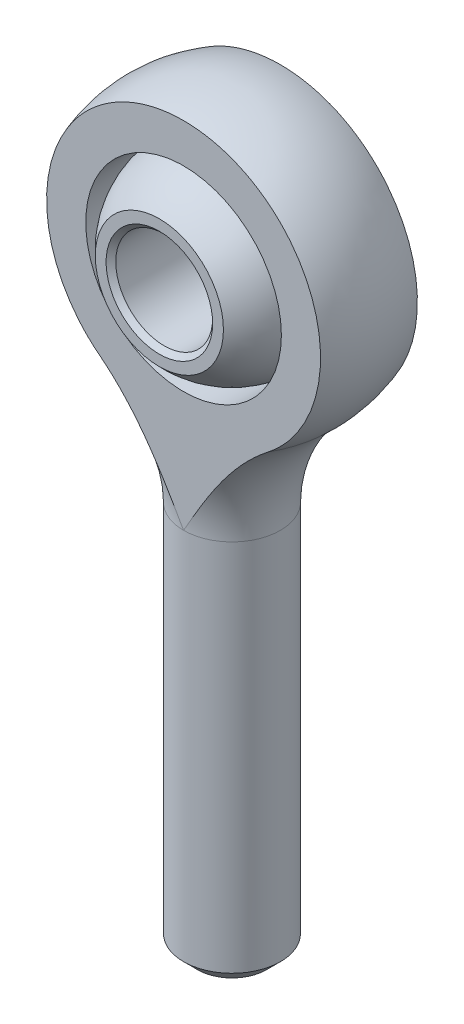
ISO-10303-21;
HEADER;
FILE_DESCRIPTION(('STEP AP214'),'2;1');
FILE_NAME('part.step','',(''),(''),'','','');
FILE_SCHEMA(('AUTOMOTIVE_DESIGN { 1 0 10303 214 1 1 1 1 }'));
ENDSEC;
DATA;
#1=APPLICATION_CONTEXT('core data for automotive mechanical design processes');
#2=APPLICATION_PROTOCOL_DEFINITION('international standard','automotive_design',2000,#1);
#3=PRODUCT_CONTEXT('',#1,'mechanical');
#4=PRODUCT('Part','Part','',(#3));
#5=PRODUCT_RELATED_PRODUCT_CATEGORY('part','',(#4));
#6=PRODUCT_DEFINITION_FORMATION('','',#4);
#7=PRODUCT_DEFINITION_CONTEXT('part definition',#1,'design');
#8=PRODUCT_DEFINITION('design','',#6,#7);
#9=PRODUCT_DEFINITION_SHAPE('','',#8);
#10=(LENGTH_UNIT() NAMED_UNIT(*) SI_UNIT(.MILLI.,.METRE.));
#11=(NAMED_UNIT(*) PLANE_ANGLE_UNIT() SI_UNIT($,.RADIAN.));
#12=(NAMED_UNIT(*) SI_UNIT($,.STERADIAN.) SOLID_ANGLE_UNIT());
#13=UNCERTAINTY_MEASURE_WITH_UNIT(LENGTH_MEASURE(1.E-05),#10,'distance_accuracy_value','');
#14=(GEOMETRIC_REPRESENTATION_CONTEXT(3) GLOBAL_UNCERTAINTY_ASSIGNED_CONTEXT((#13)) GLOBAL_UNIT_ASSIGNED_CONTEXT((#10,
#11,#12)) REPRESENTATION_CONTEXT('',''));
#15=CARTESIAN_POINT('',(0.,0.,0.));
#16=DIRECTION('',(0.,0.,1.));
#17=DIRECTION('',(1.,0.,0.));
#18=AXIS2_PLACEMENT_3D('',#15,#16,#17);
#19=CARTESIAN_POINT('',(0.,14.2875,0.));
#20=DIRECTION('',(0.,-1.,0.));
#21=DIRECTION('',(-1.,0.,0.));
#22=AXIS2_PLACEMENT_3D('',#19,#20,#21);
#23=SPHERICAL_SURFACE('',#22,6.35);
#24=CARTESIAN_POINT('',(0.,14.2875,0.));
#25=DIRECTION('',(0.,0.,1.));
#26=DIRECTION('',(0.,-1.,0.));
#27=AXIS2_PLACEMENT_3D('',#24,#25,#26);
#28=SPHERICAL_SURFACE('',#27,6.35);
#29=CARTESIAN_POINT('',(0.,14.2875,-4.76250000000001));
#30=DIRECTION('',(0.,0.,1.));
#31=DIRECTION('',(0.,-1.,0.));
#32=AXIS2_PLACEMENT_3D('',#29,#30,#31);
#33=CIRCLE('',#32,4.20013020631503);
#34=CARTESIAN_POINT('',(0.,10.087369793685,-4.76250000000001));
#35=VERTEX_POINT('',#34);
#36=EDGE_CURVE('E70',#35,#35,#33,.F.);
#37=ORIENTED_EDGE('',*,*,#36,.F.);
#38=EDGE_LOOP('',(#37));
#39=FACE_BOUND('',#38,.T.);
#40=CARTESIAN_POINT('',(0.,14.2875,4.76250000000001));
#41=DIRECTION('',(0.,0.,-1.));
#42=DIRECTION('',(0.,1.,0.));
#43=AXIS2_PLACEMENT_3D('',#40,#41,#42);
#44=CIRCLE('',#43,4.20013020631503);
#45=CARTESIAN_POINT('',(0.,18.487630206315,4.76250000000001));
#46=VERTEX_POINT('',#45);
#47=EDGE_CURVE('E69',#46,#46,#44,.F.);
#48=ORIENTED_EDGE('',*,*,#47,.F.);
#49=EDGE_LOOP('',(#48));
#50=FACE_BOUND('',#49,.T.);
#51=ADVANCED_FACE('F49',(#39,#50),#28,.T.);
#52=CARTESIAN_POINT('',(-9.52500000000001,23.8125,4.76250000000001));
#53=DIRECTION('',(0.,0.,-1.));
#54=DIRECTION('',(0.,1.,0.));
#55=AXIS2_PLACEMENT_3D('',#52,#53,#54);
#56=PLANE('',#55);
#57=CARTESIAN_POINT('',(0.,14.2875,4.76250000000001));
#58=DIRECTION('',(0.,0.,-1.));
#59=DIRECTION('',(0.,1.,0.));
#60=AXIS2_PLACEMENT_3D('',#57,#58,#59);
#61=CIRCLE('',#60,3.4925);
#62=CARTESIAN_POINT('',(0.,17.78,4.76250000000001));
#63=VERTEX_POINT('',#62);
#64=EDGE_CURVE('E11',#63,#63,#61,.T.);
#65=ORIENTED_EDGE('',*,*,#64,.T.);
#66=EDGE_LOOP('',(#65));
#67=FACE_BOUND('',#66,.T.);
#68=ORIENTED_EDGE('',*,*,#47,.T.);
#69=EDGE_LOOP('',(#68));
#70=FACE_BOUND('',#69,.T.);
#71=ADVANCED_FACE('F76',(#67,#70),#56,.F.);
#72=CARTESIAN_POINT('',(-9.52500000000001,23.8125,-4.76250000000001));
#73=DIRECTION('',(0.,0.,1.));
#74=DIRECTION('',(0.,-1.,0.));
#75=AXIS2_PLACEMENT_3D('',#72,#73,#74);
#76=PLANE('',#75);
#77=CARTESIAN_POINT('',(0.,14.2875,-4.76250000000001));
#78=DIRECTION('',(0.,0.,1.));
#79=DIRECTION('',(0.,-1.,0.));
#80=AXIS2_PLACEMENT_3D('',#77,#78,#79);
#81=CIRCLE('',#80,3.4925);
#82=CARTESIAN_POINT('',(0.,10.795,-4.76250000000001));
#83=VERTEX_POINT('',#82);
#84=EDGE_CURVE('E64',#83,#83,#81,.T.);
#85=ORIENTED_EDGE('',*,*,#84,.T.);
#86=EDGE_LOOP('',(#85));
#87=FACE_BOUND('',#86,.T.);
#88=ORIENTED_EDGE('',*,*,#36,.T.);
#89=EDGE_LOOP('',(#88));
#90=FACE_BOUND('',#89,.T.);
#91=ADVANCED_FACE('F84',(#87,#90),#76,.F.);
#92=CARTESIAN_POINT('',(0.,14.2875,-4.76250000000001));
#93=DIRECTION('',(0.,0.,1.));
#94=DIRECTION('',(1.,0.,0.));
#95=AXIS2_PLACEMENT_3D('',#92,#93,#94);
#96=CYLINDRICAL_SURFACE('',#95,3.175);
#97=CARTESIAN_POINT('',(0.,14.2875,-4.44500000000001));
#98=DIRECTION('',(0.,0.,1.));
#99=DIRECTION('',(1.,0.,0.));
#100=AXIS2_PLACEMENT_3D('',#97,#98,#99);
#101=CIRCLE('',#100,3.175);
#102=CARTESIAN_POINT('',(3.17499999999999,14.2875,-4.44500000000001));
#103=VERTEX_POINT('',#102);
#104=EDGE_CURVE('E56',#103,#103,#101,.F.);
#105=ORIENTED_EDGE('',*,*,#104,.T.);
#106=EDGE_LOOP('',(#105));
#107=FACE_BOUND('',#106,.T.);
#108=CARTESIAN_POINT('',(0.,14.2875,4.44500000000001));
#109=DIRECTION('',(0.,0.,-1.));
#110=DIRECTION('',(-1.,0.,0.));
#111=AXIS2_PLACEMENT_3D('',#108,#109,#110);
#112=CIRCLE('',#111,3.175);
#113=CARTESIAN_POINT('',(-3.17500000000001,14.2875,4.44500000000001));
#114=VERTEX_POINT('',#113);
#115=EDGE_CURVE('E60',#114,#114,#112,.F.);
#116=ORIENTED_EDGE('',*,*,#115,.T.);
#117=EDGE_LOOP('',(#116));
#118=FACE_BOUND('',#117,.T.);
#119=ADVANCED_FACE('F90',(#107,#118),#96,.F.);
#120=CARTESIAN_POINT('',(0.,14.2875,-4.76250000000001));
#121=DIRECTION('',(0.,0.,-1.));
#122=DIRECTION('',(-1.,0.,0.));
#123=AXIS2_PLACEMENT_3D('',#120,#121,#122);
#124=CONICAL_SURFACE('',#123,3.4925,0.785398163397446);
#125=ORIENTED_EDGE('',*,*,#104,.F.);
#126=EDGE_LOOP('',(#125));
#127=FACE_BOUND('',#126,.T.);
#128=ORIENTED_EDGE('',*,*,#84,.F.);
#129=EDGE_LOOP('',(#128));
#130=FACE_BOUND('',#129,.T.);
#131=ADVANCED_FACE('F88',(#127,#130),#124,.F.);
#132=CARTESIAN_POINT('',(0.,14.2875,4.44500000000001));
#133=DIRECTION('',(0.,0.,1.));
#134=DIRECTION('',(1.,0.,0.));
#135=AXIS2_PLACEMENT_3D('',#132,#133,#134);
#136=CONICAL_SURFACE('',#135,3.175,0.785398163397449);
#137=ORIENTED_EDGE('',*,*,#64,.F.);
#138=EDGE_LOOP('',(#137));
#139=FACE_BOUND('',#138,.T.);
#140=ORIENTED_EDGE('',*,*,#115,.F.);
#141=EDGE_LOOP('',(#140));
#142=FACE_BOUND('',#141,.T.);
#143=ADVANCED_FACE('F51',(#139,#142),#136,.F.);
#144=CLOSED_SHELL('',(#51,#71,#91,#119,#131,#143));
#145=MANIFOLD_SOLID_BREP('B2',#144);
#146=CARTESIAN_POINT('',(0.,0.,0.));
#147=DIRECTION('',(0.,-1.,0.));
#148=DIRECTION('',(1.,0.,0.));
#149=AXIS2_PLACEMENT_3D('',#146,#147,#148);
#150=TOROIDAL_SURFACE('',#149,12.8984375000001,9.72343750000005);
#151=CARTESIAN_POINT('',(0.,0.,-3.17500000000004));
#152=CARTESIAN_POINT('',(-0.00326153281781499,0.00570768457842981,-3.17500000000003));
#153=CARTESIAN_POINT('',(-0.00652306728920224,0.0114153698384961,-3.17500000000001));
#154=CARTESIAN_POINT('',(-0.273129494819769,0.47797424005821,-3.17499999999902));
#155=CARTESIAN_POINT('',(-0.53656019281733,0.938786382528833,-3.17499999999974));
#156=CARTESIAN_POINT('',(-1.07566265440759,1.85322785425997,-3.17500000000026));
#157=CARTESIAN_POINT('',(-1.35133223134025,2.30685844712162,-3.17500000000007));
#158=CARTESIAN_POINT('',(-1.9255960946204,3.19894900748963,-3.17499999999992));
#159=CARTESIAN_POINT('',(-2.22416629518469,3.63742422905388,-3.17499999999997));
#160=CARTESIAN_POINT('',(-2.85309895659058,4.49102276308845,-3.17500000000001));
#161=CARTESIAN_POINT('',(-3.1834439519776,4.90615870771198,-3.17499999999999));
#162=CARTESIAN_POINT('',(-3.77466960948274,5.5816275538597,-3.17499999999998));
#163=CARTESIAN_POINT('',(-4.02585009193289,5.85044049947371,-3.17499999999998));
#164=CARTESIAN_POINT('',(-4.54711374446844,6.36901465454035,-3.17499999999998));
#165=CARTESIAN_POINT('',(-4.81719088391667,6.61878188949917,-3.17499999999998));
#166=CARTESIAN_POINT('',(-5.37662445769732,7.09612768110749,-3.17499999999998));
#167=CARTESIAN_POINT('',(-5.66599147579518,7.32369388522852,-3.17499999999998));
#168=CARTESIAN_POINT('',(-6.2632271579505,7.75319037787226,-3.17499999999998));
#169=CARTESIAN_POINT('',(-6.57109562075127,7.95512094518227,-3.17499999999998));
#170=CARTESIAN_POINT('',(-7.20718830572491,8.33213779597142,-3.17499999999998));
#171=CARTESIAN_POINT('',(-7.53558873759108,8.50692791183564,-3.17499999999998));
#172=CARTESIAN_POINT('',(-8.20771747709619,8.82419193076337,-3.17499999999998));
#173=CARTESIAN_POINT('',(-8.55144656949481,8.96666417701681,-3.17499999999998));
#174=CARTESIAN_POINT('',(-9.25110720261361,9.21656726413525,-3.17499999999998));
#175=CARTESIAN_POINT('',(-9.60702765387849,9.32402906227472,-3.17499999999998));
#176=CARTESIAN_POINT('',(-10.3280020284923,9.50191139495202,-3.17499999999997));
#177=CARTESIAN_POINT('',(-10.6930544050792,9.57233815856028,-3.17499999999997));
#178=CARTESIAN_POINT('',(-11.3741481180383,9.66696888098648,-3.17499999999997));
#179=CARTESIAN_POINT('',(-11.6894621098079,9.69646467000761,-3.17499999999997));
#180=CARTESIAN_POINT('',(-12.3214131948012,9.72667494727597,-3.17499999999997));
#181=CARTESIAN_POINT('',(-12.638049989484,9.72739561225075,-3.17499999999997));
#182=CARTESIAN_POINT('',(-13.2714560119507,9.69958458821921,-3.17499999999997));
#183=CARTESIAN_POINT('',(-13.588219994093,9.67092754782781,-3.17499999999997));
#184=CARTESIAN_POINT('',(-14.0603016311228,9.60580647489647,-3.17499999999997));
#185=CARTESIAN_POINT('',(-14.2172131667071,9.58039570298993,-3.17499999999997));
#186=CARTESIAN_POINT('',(-14.5296709920143,9.52221005306687,-3.17499999999997));
#187=CARTESIAN_POINT('',(-14.6852172276829,9.48943488483732,-3.17499999999997));
#188=CARTESIAN_POINT('',(-14.8399244091396,9.4529887096785,-3.17499999999997));
#189=B_SPLINE_CURVE_WITH_KNOTS('',3,(#151,#152,#153,#154,#155,#156,#157,#158,#159,#160,#161,
#162,#163,#164,#165,#166,#167,#168,#169,#170,#171,#172,#173,#174,#175,#176,#177,#178,#179,#180,
#181,#182,#183,#184,#185,#186,#187,#188),.UNSPECIFIED.,.F.,.F.,(4,2,2,2,2,2,2,2,2,2,2,2,2,2,2,2,
2,2,4),(0.,0.0197214984217778,1.6120807751767,3.20415668894376,4.79458050788114,
6.38413507044195,7.4869976182805,8.58950979242387,9.69263194085263,10.7957420918107,
11.9101519431254,13.0246189129445,14.138097746497,15.2513892396472,16.2001992989044,
17.1488056901342,18.1014765944114,18.5781908799935,19.0549239550265),.UNSPECIFIED.);
#190=CARTESIAN_POINT('',(0.,0.,-3.175));
#191=VERTEX_POINT('',#190);
#192=CARTESIAN_POINT('',(-5.53702467552874,7.21739690721655,-3.17499999999998));
#193=VERTEX_POINT('',#192);
#194=EDGE_CURVE('E143',#191,#193,#189,.T.);
#195=ORIENTED_EDGE('',*,*,#194,.F.);
#196=CARTESIAN_POINT('',(0.,0.,0.));
#197=DIRECTION('',(0.,1.,0.));
#198=DIRECTION('',(-1.,0.,0.));
#199=AXIS2_PLACEMENT_3D('',#196,#197,#198);
#200=CIRCLE('',#199,3.17500000000001);
#201=CARTESIAN_POINT('',(0.,0.,3.175));
#202=VERTEX_POINT('',#201);
#203=EDGE_CURVE('E171',#191,#202,#200,.T.);
#204=ORIENTED_EDGE('',*,*,#203,.T.);
#205=CARTESIAN_POINT('',(0.,0.,3.17500000000004));
#206=CARTESIAN_POINT('',(-0.00326153281826064,0.00570768457820321,3.17500000000002));
#207=CARTESIAN_POINT('',(-0.00652306729008409,0.0114153698380202,3.17500000000001));
#208=CARTESIAN_POINT('',(-0.273129494857372,0.477974240040989,3.17499999999897));
#209=CARTESIAN_POINT('',(-0.536560192830577,0.938786382529774,3.17499999999972));
#210=CARTESIAN_POINT('',(-1.07566265440541,1.85322785427782,3.17500000000027));
#211=CARTESIAN_POINT('',(-1.351332231347,2.30685844713824,3.17500000000007));
#212=CARTESIAN_POINT('',(-1.92559609463569,3.1989490075073,3.17499999999992));
#213=CARTESIAN_POINT('',(-2.22416629519955,3.63742422907386,3.17499999999998));
#214=CARTESIAN_POINT('',(-2.85309895660777,4.491022763112,3.17500000000002));
#215=CARTESIAN_POINT('',(-3.1834439519976,4.90615870773673,3.175));
#216=CARTESIAN_POINT('',(-3.77466960950509,5.58162755388393,3.17499999999999));
#217=CARTESIAN_POINT('',(-4.02585009195468,5.85044049949639,3.175));
#218=CARTESIAN_POINT('',(-4.54711374448913,6.36901465455996,3.175));
#219=CARTESIAN_POINT('',(-4.81719088393681,6.61878188951727,3.175));
#220=CARTESIAN_POINT('',(-5.37662445771715,7.09612768112351,3.175));
#221=CARTESIAN_POINT('',(-5.66599147581532,7.3236938852439,3.175));
#222=CARTESIAN_POINT('',(-6.26322715797132,7.75319037788635,3.175));
#223=CARTESIAN_POINT('',(-6.57109562077246,7.95512094519572,3.175));
#224=CARTESIAN_POINT('',(-7.20718830574653,8.33213779598334,3.175));
#225=CARTESIAN_POINT('',(-7.53558873761273,8.5069279118467,3.175));
#226=CARTESIAN_POINT('',(-8.20771747711777,8.82419193077271,3.175));
#227=CARTESIAN_POINT('',(-8.55144656951629,8.96666417702529,3.175));
#228=CARTESIAN_POINT('',(-9.25110720263402,9.21656726414174,3.175));
#229=CARTESIAN_POINT('',(-9.60702765389789,9.32402906228017,3.175));
#230=CARTESIAN_POINT('',(-10.3280020285096,9.50191139495562,3.175));
#231=CARTESIAN_POINT('',(-10.6930544050953,9.57233815856306,3.175));
#232=CARTESIAN_POINT('',(-11.3741481180527,9.66696888098802,3.175));
#233=CARTESIAN_POINT('',(-11.6894621098218,9.69646467000867,3.175));
#234=CARTESIAN_POINT('',(-12.3214131948138,9.72667494727617,3.175));
#235=CARTESIAN_POINT('',(-12.6380499894959,9.72739561225058,3.175));
#236=CARTESIAN_POINT('',(-13.2714560119622,9.69958458821836,3.175));
#237=CARTESIAN_POINT('',(-13.5882199941047,9.67092754782658,3.175));
#238=CARTESIAN_POINT('',(-14.0603016311347,9.60580647489463,3.175));
#239=CARTESIAN_POINT('',(-14.2172131667191,9.58039570298789,3.175));
#240=CARTESIAN_POINT('',(-14.5296709920265,9.52221005306439,3.175));
#241=CARTESIAN_POINT('',(-14.6852172276952,9.48943488483463,3.175));
#242=CARTESIAN_POINT('',(-14.839924409152,9.45298870967559,3.175));
#243=B_SPLINE_CURVE_WITH_KNOTS('',3,(#205,#206,#207,#208,#209,#210,#211,#212,#213,#214,#215,
#216,#217,#218,#219,#220,#221,#222,#223,#224,#225,#226,#227,#228,#229,#230,#231,#232,#233,#234,
#235,#236,#237,#238,#239,#240,#241,#242),.UNSPECIFIED.,.F.,.F.,(4,2,2,2,2,2,2,2,2,2,2,2,2,2,2,2,
2,2,4),(0.,0.0197214984217778,1.61208077518774,3.20415668896486,4.79458050790775,
6.38413507047632,7.48699761831038,8.58950979244946,9.69263194087775,10.7957420918357,
11.9101519431492,13.0246189129672,14.1380977465159,15.2513892396623,16.2001992989176,
17.1488056901454,18.1014765944234,18.5781908800058,19.0549239550392),.UNSPECIFIED.);
#244=CARTESIAN_POINT('',(-5.53702467552873,7.21739690721655,3.175));
#245=VERTEX_POINT('',#244);
#246=EDGE_CURVE('E175',#245,#202,#243,.F.);
#247=ORIENTED_EDGE('',*,*,#246,.F.);
#248=CARTESIAN_POINT('',(0.,7.21739690721653,0.));
#249=DIRECTION('',(0.,-1.,0.));
#250=DIRECTION('',(1.,0.,0.));
#251=AXIS2_PLACEMENT_3D('',#248,#249,#250);
#252=CIRCLE('',#251,6.38273195876294);
#253=EDGE_CURVE('E174',#245,#193,#252,.T.);
#254=ORIENTED_EDGE('',*,*,#253,.T.);
#255=EDGE_LOOP('',(#195,#204,#247,#254));
#256=FACE_BOUND('',#255,.T.);
#257=ADVANCED_FACE('F129',(#256),#150,.F.);
#258=CARTESIAN_POINT('',(0.,-25.4,0.));
#259=DIRECTION('',(0.,1.,0.));
#260=DIRECTION('',(-1.,0.,0.));
#261=AXIS2_PLACEMENT_3D('',#258,#259,#260);
#262=PLANE('',#261);
#263=CARTESIAN_POINT('',(0.,-25.4,0.));
#264=DIRECTION('',(0.,1.,0.));
#265=DIRECTION('',(-1.,0.,0.));
#266=AXIS2_PLACEMENT_3D('',#263,#264,#265);
#267=CIRCLE('',#266,2.26785714285714);
#268=CARTESIAN_POINT('',(-2.26785714285713,-25.4,0.));
#269=VERTEX_POINT('',#268);
#270=EDGE_CURVE('E186',#269,#269,#267,.F.);
#271=ORIENTED_EDGE('',*,*,#270,.T.);
#272=EDGE_LOOP('',(#271));
#273=FACE_BOUND('',#272,.T.);
#274=ADVANCED_FACE('F223',(#273),#262,.F.);
#275=CARTESIAN_POINT('',(0.,23.8125,0.));
#276=DIRECTION('',(0.,1.,0.));
#277=DIRECTION('',(-1.,0.,0.));
#278=AXIS2_PLACEMENT_3D('',#275,#276,#277);
#279=CYLINDRICAL_SURFACE('',#278,3.17500000000001);
#280=CARTESIAN_POINT('',(0.,-24.4928571428571,0.));
#281=DIRECTION('',(0.,1.,0.));
#282=DIRECTION('',(-1.,0.,0.));
#283=AXIS2_PLACEMENT_3D('',#280,#281,#282);
#284=CIRCLE('',#283,3.17500000000001);
#285=CARTESIAN_POINT('',(-3.175,-24.4928571428571,0.));
#286=VERTEX_POINT('',#285);
#287=EDGE_CURVE('E184',#286,#286,#284,.T.);
#288=ORIENTED_EDGE('',*,*,#287,.T.);
#289=EDGE_LOOP('',(#288));
#290=FACE_BOUND('',#289,.T.);
#291=EDGE_CURVE('E180',#202,#191,#200,.T.);
#292=ORIENTED_EDGE('',*,*,#291,.F.);
#293=ORIENTED_EDGE('',*,*,#203,.F.);
#294=EDGE_LOOP('',(#292,#293));
#295=FACE_BOUND('',#294,.T.);
#296=ADVANCED_FACE('F179',(#290,#295),#279,.T.);
#297=CARTESIAN_POINT('',(0.,-24.4928571428571,0.));
#298=DIRECTION('',(0.,1.,0.));
#299=DIRECTION('',(-1.,0.,0.));
#300=AXIS2_PLACEMENT_3D('',#297,#298,#299);
#301=CONICAL_SURFACE('',#300,3.17500000000001,0.78539816339745);
#302=CARTESIAN_POINT('',(-2.26785714285713,-25.4,0.));
#303=CARTESIAN_POINT('',(-2.27730654761903,-25.3905505952381,0.));
#304=CARTESIAN_POINT('',(-2.28675595238094,-25.3811011904762,0.));
#305=CARTESIAN_POINT('',(-2.30565476190475,-25.3622023809524,0.));
#306=CARTESIAN_POINT('',(-2.31510416666665,-25.3527529761905,0.));
#307=CARTESIAN_POINT('',(-2.33400297619046,-25.3338541666667,0.));
#308=CARTESIAN_POINT('',(-2.34345238095237,-25.3244047619048,0.));
#309=CARTESIAN_POINT('',(-2.36235119047618,-25.3055059523809,0.));
#310=CARTESIAN_POINT('',(-2.37180059523808,-25.296056547619,0.));
#311=CARTESIAN_POINT('',(-2.39069940476189,-25.2771577380952,0.));
#312=CARTESIAN_POINT('',(-2.4001488095238,-25.2677083333333,0.));
#313=CARTESIAN_POINT('',(-2.41904761904761,-25.2488095238095,0.));
#314=CARTESIAN_POINT('',(-2.42849702380951,-25.2393601190476,0.));
#315=CARTESIAN_POINT('',(-2.44739583333332,-25.2204613095238,0.));
#316=CARTESIAN_POINT('',(-2.45684523809523,-25.2110119047619,0.));
#317=CARTESIAN_POINT('',(-2.47574404761904,-25.1921130952381,0.));
#318=CARTESIAN_POINT('',(-2.48519345238094,-25.1826636904762,0.));
#319=CARTESIAN_POINT('',(-2.50409226190475,-25.1637648809524,0.));
#320=CARTESIAN_POINT('',(-2.51354166666666,-25.1543154761905,0.));
#321=CARTESIAN_POINT('',(-2.53244047619047,-25.1354166666667,0.));
#322=CARTESIAN_POINT('',(-2.54188988095237,-25.1259672619048,0.));
#323=CARTESIAN_POINT('',(-2.56078869047618,-25.1070684523809,0.));
#324=CARTESIAN_POINT('',(-2.57023809523808,-25.097619047619,0.));
#325=CARTESIAN_POINT('',(-2.58913690476189,-25.0787202380952,0.));
#326=CARTESIAN_POINT('',(-2.5985863095238,-25.0692708333333,0.));
#327=CARTESIAN_POINT('',(-2.61748511904761,-25.0503720238095,0.));
#328=CARTESIAN_POINT('',(-2.62693452380951,-25.0409226190476,0.));
#329=CARTESIAN_POINT('',(-2.64583333333332,-25.0220238095238,0.));
#330=CARTESIAN_POINT('',(-2.65528273809523,-25.0125744047619,0.));
#331=CARTESIAN_POINT('',(-2.67418154761904,-24.9936755952381,0.));
#332=CARTESIAN_POINT('',(-2.68363095238094,-24.9842261904762,0.));
#333=CARTESIAN_POINT('',(-2.70252976190475,-24.9653273809524,0.));
#334=CARTESIAN_POINT('',(-2.71197916666666,-24.9558779761905,0.));
#335=CARTESIAN_POINT('',(-2.73087797619047,-24.9369791666667,0.));
#336=CARTESIAN_POINT('',(-2.74032738095237,-24.9275297619048,0.));
#337=CARTESIAN_POINT('',(-2.75922619047618,-24.9086309523809,0.));
#338=CARTESIAN_POINT('',(-2.76867559523809,-24.899181547619,0.));
#339=CARTESIAN_POINT('',(-2.7875744047619,-24.8802827380952,0.));
#340=CARTESIAN_POINT('',(-2.7970238095238,-24.8708333333333,0.));
#341=CARTESIAN_POINT('',(-2.81592261904761,-24.8519345238095,0.));
#342=CARTESIAN_POINT('',(-2.82537202380952,-24.8424851190476,0.));
#343=CARTESIAN_POINT('',(-2.84427083333333,-24.8235863095238,0.));
#344=CARTESIAN_POINT('',(-2.85372023809523,-24.8141369047619,0.));
#345=CARTESIAN_POINT('',(-2.87261904761904,-24.7952380952381,0.));
#346=CARTESIAN_POINT('',(-2.88206845238095,-24.7857886904762,0.));
#347=CARTESIAN_POINT('',(-2.90096726190476,-24.7668898809524,0.));
#348=CARTESIAN_POINT('',(-2.91041666666666,-24.7574404761905,0.));
#349=CARTESIAN_POINT('',(-2.92931547619047,-24.7385416666667,0.));
#350=CARTESIAN_POINT('',(-2.93876488095238,-24.7290922619048,0.));
#351=CARTESIAN_POINT('',(-2.95766369047619,-24.7101934523809,0.));
#352=CARTESIAN_POINT('',(-2.96711309523809,-24.700744047619,0.));
#353=CARTESIAN_POINT('',(-2.9860119047619,-24.6818452380952,0.));
#354=CARTESIAN_POINT('',(-2.99546130952381,-24.6723958333333,0.));
#355=CARTESIAN_POINT('',(-3.01436011904762,-24.6534970238095,0.));
#356=CARTESIAN_POINT('',(-3.02380952380952,-24.6440476190476,0.));
#357=CARTESIAN_POINT('',(-3.04270833333333,-24.6251488095238,0.));
#358=CARTESIAN_POINT('',(-3.05215773809523,-24.6156994047619,0.));
#359=CARTESIAN_POINT('',(-3.07105654761904,-24.5968005952381,0.));
#360=CARTESIAN_POINT('',(-3.08050595238095,-24.5873511904762,0.));
#361=CARTESIAN_POINT('',(-3.09940476190476,-24.5684523809524,0.));
#362=CARTESIAN_POINT('',(-3.10885416666666,-24.5590029761905,0.));
#363=CARTESIAN_POINT('',(-3.12775297619047,-24.5401041666667,0.));
#364=CARTESIAN_POINT('',(-3.13720238095238,-24.5306547619047,0.));
#365=CARTESIAN_POINT('',(-3.15610119047619,-24.5117559523809,0.));
#366=CARTESIAN_POINT('',(-3.16555059523809,-24.502306547619,0.));
#367=CARTESIAN_POINT('',(-3.175,-24.4928571428571,0.));
#368=B_SPLINE_CURVE_WITH_KNOTS('',3,(#302,#303,#304,#305,#306,#307,#308,#309,#310,#311,#312,
#313,#314,#315,#316,#317,#318,#319,#320,#321,#322,#323,#324,#325,#326,#327,#328,#329,#330,#331,
#332,#333,#334,#335,#336,#337,#338,#339,#340,#341,#342,#343,#344,#345,#346,#347,#348,#349,#350,
#351,#352,#353,#354,#355,#356,#357,#358,#359,#360,#361,#362,#363,#364,#365,#366,#367),
.UNSPECIFIED.,.F.,.F.,(4,2,2,2,2,2,2,2,2,2,2,2,2,2,2,2,2,2,2,2,2,2,2,2,2,2,2,2,2,2,2,2,4),(0.,
0.0400904291119143,0.080180858223831,0.120271287335748,0.160361716447665,0.200452145559581,
0.240542574671498,0.280633003783413,0.32072343289533,0.360813862007246,0.400904291119163,
0.44099472023108,0.481085149342997,0.521175578454913,0.561266007566828,0.601356436678744,
0.641446865790661,0.681537294902578,0.721627724014495,0.761718153126412,0.801808582238326,
0.841899011350243,0.88198944046216,0.922079869574076,0.962170298685993,1.00226072779791,
1.04235115690982,1.08244158602174,1.12253201513366,1.16262244424557,1.20271287335749,
1.24280330246941,1.28289373158132),.UNSPECIFIED.);
#369=EDGE_CURVE('BSEAM131',#269,#286,#368,.T.);
#370=ORIENTED_EDGE('',*,*,#270,.F.);
#371=ORIENTED_EDGE('',*,*,#287,.F.);
#372=ORIENTED_EDGE('',*,*,#369,.T.);
#373=ORIENTED_EDGE('',*,*,#369,.F.);
#374=EDGE_LOOP('',(#370,#372,#371,#373));
#375=FACE_BOUND('',#374,.T.);
#376=ADVANCED_FACE('F131',(#375),#301,.T.);
#377=CARTESIAN_POINT('',(0.,0.,-3.17500000000004));
#378=CARTESIAN_POINT('',(0.00326153281767971,0.00570768457842979,-3.17500000000003));
#379=CARTESIAN_POINT('',(0.00652306728906698,0.0114153698384961,-3.17500000000001));
#380=CARTESIAN_POINT('',(0.273129494819636,0.477974240058208,-3.17499999999902));
#381=CARTESIAN_POINT('',(0.5365601928172,0.938786382528831,-3.17499999999974));
#382=CARTESIAN_POINT('',(1.07566265440746,1.85322785425996,-3.17500000000026));
#383=CARTESIAN_POINT('',(1.35133223134013,2.30685844712161,-3.17500000000007));
#384=CARTESIAN_POINT('',(1.92559609462028,3.19894900748962,-3.17499999999992));
#385=CARTESIAN_POINT('',(2.22416629518457,3.63742422905386,-3.17499999999997));
#386=CARTESIAN_POINT('',(2.85309895659047,4.49102276308844,-3.17500000000001));
#387=CARTESIAN_POINT('',(3.18344395197748,4.90615870771196,-3.17499999999999));
#388=CARTESIAN_POINT('',(3.77466960948264,5.58162755385968,-3.17499999999998));
#389=CARTESIAN_POINT('',(4.02585009193278,5.85044049947369,-3.17499999999998));
#390=CARTESIAN_POINT('',(4.54711374446834,6.36901465454033,-3.17499999999998));
#391=CARTESIAN_POINT('',(4.81719088391657,6.61878188949915,-3.17499999999998));
#392=CARTESIAN_POINT('',(5.37662445769722,7.09612768110747,-3.17499999999998));
#393=CARTESIAN_POINT('',(5.66599147579509,7.32369388522849,-3.17499999999998));
#394=CARTESIAN_POINT('',(6.26322715795041,7.75319037787223,-3.17499999999998));
#395=CARTESIAN_POINT('',(6.57109562075117,7.95512094518223,-3.17499999999998));
#396=CARTESIAN_POINT('',(7.20718830572482,8.33213779597138,-3.17499999999998));
#397=CARTESIAN_POINT('',(7.53558873759099,8.5069279118356,-3.17499999999998));
#398=CARTESIAN_POINT('',(8.2077174770961,8.82419193076333,-3.17499999999998));
#399=CARTESIAN_POINT('',(8.55144656949472,8.96666417701677,-3.17499999999998));
#400=CARTESIAN_POINT('',(9.25110720261353,9.2165672641352,-3.17499999999998));
#401=CARTESIAN_POINT('',(9.6070276538784,9.32402906227466,-3.17499999999998));
#402=CARTESIAN_POINT('',(10.3280020284922,9.50191139495196,-3.17499999999997));
#403=CARTESIAN_POINT('',(10.6930544050791,9.57233815856022,-3.17499999999997));
#404=CARTESIAN_POINT('',(11.3741481180382,9.66696888098642,-3.17499999999997));
#405=CARTESIAN_POINT('',(11.6894621098078,9.69646467000755,-3.17499999999997));
#406=CARTESIAN_POINT('',(12.3214131948011,9.7266749472759,-3.17499999999997));
#407=CARTESIAN_POINT('',(12.6380499894839,9.72739561225069,-3.17499999999997));
#408=CARTESIAN_POINT('',(13.2714560119506,9.69958458821914,-3.17499999999997));
#409=CARTESIAN_POINT('',(13.5882199940929,9.67092754782774,-3.17499999999997));
#410=CARTESIAN_POINT('',(14.0603016311227,9.6058064748964,-3.17499999999997));
#411=CARTESIAN_POINT('',(14.217213166707,9.58039570298986,-3.17499999999997));
#412=CARTESIAN_POINT('',(14.5296709920142,9.52221005306679,-3.17499999999997));
#413=CARTESIAN_POINT('',(14.6852172276828,9.48943488483724,-3.17499999999997));
#414=CARTESIAN_POINT('',(14.8399244091396,9.45298870967843,-3.17499999999997));
#415=B_SPLINE_CURVE_WITH_KNOTS('',3,(#377,#378,#379,#380,#381,#382,#383,#384,#385,#386,#387,
#388,#389,#390,#391,#392,#393,#394,#395,#396,#397,#398,#399,#400,#401,#402,#403,#404,#405,#406,
#407,#408,#409,#410,#411,#412,#413,#414),.UNSPECIFIED.,.F.,.F.,(4,2,2,2,2,2,2,2,2,2,2,2,2,2,2,2,
2,2,4),(0.,0.0197214984217778,1.6120807751767,3.20415668894376,4.79458050788114,
6.38413507044195,7.4869976182805,8.58950979242387,9.69263194085263,10.7957420918107,
11.9101519431254,13.0246189129445,14.138097746497,15.2513892396472,16.2001992989044,
17.1488056901342,18.1014765944114,18.5781908799935,19.0549239550265),.UNSPECIFIED.);
#416=CARTESIAN_POINT('',(5.53702467552867,7.21739690721652,-3.17499999999998));
#417=VERTEX_POINT('',#416);
#418=EDGE_CURVE('E162',#417,#191,#415,.F.);
#419=ORIENTED_EDGE('',*,*,#418,.F.);
#420=CARTESIAN_POINT('',(5.53702467552866,7.21739690721652,3.175));
#421=VERTEX_POINT('',#420);
#422=EDGE_CURVE('E151',#417,#421,#252,.T.);
#423=ORIENTED_EDGE('',*,*,#422,.T.);
#424=CARTESIAN_POINT('',(0.,0.,3.17500000000004));
#425=CARTESIAN_POINT('',(0.00326153281812536,0.00570768457820319,3.17500000000002));
#426=CARTESIAN_POINT('',(0.00652306728994884,0.0114153698380202,3.17500000000001));
#427=CARTESIAN_POINT('',(0.273129494857239,0.477974240040987,3.17499999999897));
#428=CARTESIAN_POINT('',(0.536560192830451,0.938786382529768,3.17499999999972));
#429=CARTESIAN_POINT('',(1.07566265440529,1.85322785427781,3.17500000000027));
#430=CARTESIAN_POINT('',(1.35133223134687,2.30685844713823,3.17500000000007));
#431=CARTESIAN_POINT('',(1.92559609463557,3.19894900750729,3.17499999999992));
#432=CARTESIAN_POINT('',(2.22416629519943,3.63742422907385,3.17499999999998));
#433=CARTESIAN_POINT('',(2.85309895660766,4.49102276311198,3.17500000000002));
#434=CARTESIAN_POINT('',(3.18344395199749,4.90615870773671,3.175));
#435=CARTESIAN_POINT('',(3.77466960950498,5.58162755388391,3.17499999999999));
#436=CARTESIAN_POINT('',(4.02585009195457,5.85044049949636,3.175));
#437=CARTESIAN_POINT('',(4.54711374448903,6.36901465455993,3.175));
#438=CARTESIAN_POINT('',(4.81719088393671,6.61878188951725,3.175));
#439=CARTESIAN_POINT('',(5.37662445771705,7.09612768112348,3.175));
#440=CARTESIAN_POINT('',(5.66599147581522,7.32369388524387,3.175));
#441=CARTESIAN_POINT('',(6.26322715797122,7.75319037788632,3.175));
#442=CARTESIAN_POINT('',(6.57109562077236,7.95512094519568,3.175));
#443=CARTESIAN_POINT('',(7.20718830574643,8.3321377959833,3.175));
#444=CARTESIAN_POINT('',(7.53558873761263,8.50692791184666,3.175));
#445=CARTESIAN_POINT('',(8.20771747711768,8.82419193077266,3.175));
#446=CARTESIAN_POINT('',(8.5514465695162,8.96666417702524,3.175));
#447=CARTESIAN_POINT('',(9.25110720263393,9.21656726414169,3.175));
#448=CARTESIAN_POINT('',(9.6070276538978,9.32402906228012,3.175));
#449=CARTESIAN_POINT('',(10.3280020285095,9.50191139495557,3.175));
#450=CARTESIAN_POINT('',(10.6930544050952,9.57233815856301,3.175));
#451=CARTESIAN_POINT('',(11.3741481180526,9.66696888098797,3.175));
#452=CARTESIAN_POINT('',(11.6894621098217,9.69646467000861,3.175));
#453=CARTESIAN_POINT('',(12.3214131948137,9.7266749472761,3.175));
#454=CARTESIAN_POINT('',(12.6380499894958,9.72739561225051,3.175));
#455=CARTESIAN_POINT('',(13.2714560119621,9.69958458821829,3.175));
#456=CARTESIAN_POINT('',(13.5882199941046,9.67092754782651,3.175));
#457=CARTESIAN_POINT('',(14.0603016311346,9.60580647489456,3.175));
#458=CARTESIAN_POINT('',(14.217213166719,9.58039570298782,3.175));
#459=CARTESIAN_POINT('',(14.5296709920264,9.52221005306433,3.175));
#460=CARTESIAN_POINT('',(14.6852172276951,9.48943488483456,3.175));
#461=CARTESIAN_POINT('',(14.8399244091519,9.45298870967552,3.175));
#462=B_SPLINE_CURVE_WITH_KNOTS('',3,(#424,#425,#426,#427,#428,#429,#430,#431,#432,#433,#434,
#435,#436,#437,#438,#439,#440,#441,#442,#443,#444,#445,#446,#447,#448,#449,#450,#451,#452,#453,
#454,#455,#456,#457,#458,#459,#460,#461),.UNSPECIFIED.,.F.,.F.,(4,2,2,2,2,2,2,2,2,2,2,2,2,2,2,2,
2,2,4),(0.,0.0197214984217778,1.61208077518774,3.20415668896486,4.79458050790775,
6.38413507047632,7.48699761831038,8.58950979244946,9.69263194087775,10.7957420918357,
11.9101519431492,13.0246189129671,14.1380977465159,15.2513892396623,16.2001992989176,
17.1488056901454,18.1014765944234,18.5781908800058,19.0549239550392),.UNSPECIFIED.);
#463=EDGE_CURVE('E183',#202,#421,#462,.T.);
#464=ORIENTED_EDGE('',*,*,#463,.F.);
#465=ORIENTED_EDGE('',*,*,#291,.T.);
#466=EDGE_LOOP('',(#419,#423,#464,#465));
#467=FACE_BOUND('',#466,.T.);
#468=ADVANCED_FACE('F182',(#467),#150,.F.);
#469=CARTESIAN_POINT('',(0.,14.2875,0.));
#470=DIRECTION('',(0.,-1.,0.));
#471=DIRECTION('',(1.,0.,0.));
#472=AXIS2_PLACEMENT_3D('',#469,#470,#471);
#473=SPHERICAL_SURFACE('',#472,9.525);
#474=CARTESIAN_POINT('',(0.,14.2875,-3.17499999999996));
#475=DIRECTION('',(0.,0.,1.));
#476=DIRECTION('',(0.,-1.,0.));
#477=AXIS2_PLACEMENT_3D('',#474,#475,#476);
#478=CIRCLE('',#477,8.98025612106917);
#479=EDGE_CURVE('E47',#193,#417,#478,.F.);
#480=ORIENTED_EDGE('',*,*,#479,.F.);
#481=ORIENTED_EDGE('',*,*,#253,.F.);
#482=CARTESIAN_POINT('',(0.,14.2875,3.175));
#483=DIRECTION('',(0.,0.,-1.));
#484=DIRECTION('',(0.,1.,0.));
#485=AXIS2_PLACEMENT_3D('',#482,#483,#484);
#486=CIRCLE('',#485,8.98025612106915);
#487=EDGE_CURVE('E137',#421,#245,#486,.F.);
#488=ORIENTED_EDGE('',*,*,#487,.F.);
#489=ORIENTED_EDGE('',*,*,#422,.F.);
#490=EDGE_LOOP('',(#480,#481,#488,#489));
#491=FACE_BOUND('',#490,.T.);
#492=ADVANCED_FACE('F197',(#491),#473,.T.);
#493=CARTESIAN_POINT('',(-9.52500000000001,23.8125,3.175));
#494=DIRECTION('',(0.,0.,-1.));
#495=DIRECTION('',(0.,1.,0.));
#496=AXIS2_PLACEMENT_3D('',#493,#494,#495);
#497=PLANE('',#496);
#498=CARTESIAN_POINT('',(0.,14.2875,3.17500000000001));
#499=DIRECTION('',(0.,0.,1.));
#500=DIRECTION('',(1.,0.,0.));
#501=AXIS2_PLACEMENT_3D('',#498,#499,#500);
#502=CIRCLE('',#501,6.4135);
#503=CARTESIAN_POINT('',(6.41349999999999,14.2875,3.17500000000001));
#504=VERTEX_POINT('',#503);
#505=EDGE_CURVE('E280',#504,#504,#502,.T.);
#506=ORIENTED_EDGE('',*,*,#505,.F.);
#507=EDGE_LOOP('',(#506));
#508=FACE_BOUND('',#507,.T.);
#509=ORIENTED_EDGE('',*,*,#463,.T.);
#510=ORIENTED_EDGE('',*,*,#487,.T.);
#511=ORIENTED_EDGE('',*,*,#246,.T.);
#512=EDGE_LOOP('',(#509,#510,#511));
#513=FACE_BOUND('',#512,.T.);
#514=ADVANCED_FACE('F194',(#508,#513),#497,.F.);
#515=CARTESIAN_POINT('',(-9.52500000000001,0.,-3.175));
#516=DIRECTION('',(0.,0.,1.));
#517=DIRECTION('',(0.,-1.,0.));
#518=AXIS2_PLACEMENT_3D('',#515,#516,#517);
#519=PLANE('',#518);
#520=CARTESIAN_POINT('',(0.,14.2875,-3.17500000000001));
#521=DIRECTION('',(0.,0.,1.));
#522=DIRECTION('',(1.,0.,0.));
#523=AXIS2_PLACEMENT_3D('',#520,#521,#522);
#524=CIRCLE('',#523,6.4135);
#525=CARTESIAN_POINT('',(6.41349999999999,14.2875,-3.17500000000001));
#526=VERTEX_POINT('',#525);
#527=EDGE_CURVE('E165',#526,#526,#524,.T.);
#528=ORIENTED_EDGE('',*,*,#527,.T.);
#529=EDGE_LOOP('',(#528));
#530=FACE_BOUND('',#529,.T.);
#531=ORIENTED_EDGE('',*,*,#194,.T.);
#532=ORIENTED_EDGE('',*,*,#479,.T.);
#533=ORIENTED_EDGE('',*,*,#418,.T.);
#534=EDGE_LOOP('',(#531,#532,#533));
#535=FACE_BOUND('',#534,.T.);
#536=ADVANCED_FACE('F163',(#530,#535),#519,.F.);
#537=CARTESIAN_POINT('',(0.,14.2875,-3.17500000000001));
#538=DIRECTION('',(0.,0.,1.));
#539=DIRECTION('',(1.,0.,0.));
#540=AXIS2_PLACEMENT_3D('',#537,#538,#539);
#541=CYLINDRICAL_SURFACE('',#540,6.4135);
#542=CARTESIAN_POINT('',(6.41349999999999,14.2875,-3.17500000000001));
#543=CARTESIAN_POINT('',(6.41349999999999,14.2875,-3.10885416666667));
#544=CARTESIAN_POINT('',(6.41349999999999,14.2875,-3.04270833333334));
#545=CARTESIAN_POINT('',(6.41349999999999,14.2875,-2.91041666666667));
#546=CARTESIAN_POINT('',(6.41349999999999,14.2875,-2.84427083333334));
#547=CARTESIAN_POINT('',(6.41349999999999,14.2875,-2.71197916666667));
#548=CARTESIAN_POINT('',(6.41349999999999,14.2875,-2.64583333333334));
#549=CARTESIAN_POINT('',(6.41349999999999,14.2875,-2.51354166666667));
#550=CARTESIAN_POINT('',(6.41349999999999,14.2875,-2.44739583333334));
#551=CARTESIAN_POINT('',(6.41349999999999,14.2875,-2.31510416666667));
#552=CARTESIAN_POINT('',(6.41349999999999,14.2875,-2.24895833333334));
#553=CARTESIAN_POINT('',(6.41349999999999,14.2875,-2.11666666666667));
#554=CARTESIAN_POINT('',(6.41349999999999,14.2875,-2.05052083333334));
#555=CARTESIAN_POINT('',(6.41349999999999,14.2875,-1.91822916666667));
#556=CARTESIAN_POINT('',(6.41349999999999,14.2875,-1.85208333333334));
#557=CARTESIAN_POINT('',(6.41349999999999,14.2875,-1.71979166666667));
#558=CARTESIAN_POINT('',(6.41349999999999,14.2875,-1.65364583333334));
#559=CARTESIAN_POINT('',(6.41349999999999,14.2875,-1.52135416666667));
#560=CARTESIAN_POINT('',(6.41349999999999,14.2875,-1.45520833333334));
#561=CARTESIAN_POINT('',(6.41349999999999,14.2875,-1.32291666666667));
#562=CARTESIAN_POINT('',(6.41349999999999,14.2875,-1.25677083333334));
#563=CARTESIAN_POINT('',(6.41349999999999,14.2875,-1.12447916666667));
#564=CARTESIAN_POINT('',(6.41349999999999,14.2875,-1.05833333333334));
#565=CARTESIAN_POINT('',(6.41349999999999,14.2875,-0.92604166666667));
#566=CARTESIAN_POINT('',(6.41349999999999,14.2875,-0.859895833333336));
#567=CARTESIAN_POINT('',(6.41349999999999,14.2875,-0.727604166666669));
#568=CARTESIAN_POINT('',(6.41349999999999,14.2875,-0.661458333333335));
#569=CARTESIAN_POINT('',(6.41349999999999,14.2875,-0.529166666666668));
#570=CARTESIAN_POINT('',(6.41349999999999,14.2875,-0.463020833333335));
#571=CARTESIAN_POINT('',(6.41349999999999,14.2875,-0.330729166666668));
#572=CARTESIAN_POINT('',(6.41349999999999,14.2875,-0.264583333333335));
#573=CARTESIAN_POINT('',(6.41349999999999,14.2875,-0.132291666666668));
#574=CARTESIAN_POINT('',(6.41349999999999,14.2875,-0.066145833333334));
#575=CARTESIAN_POINT('',(6.41349999999999,14.2875,0.0661458333333331));
#576=CARTESIAN_POINT('',(6.41349999999999,14.2875,0.132291666666667));
#577=CARTESIAN_POINT('',(6.41349999999999,14.2875,0.264583333333334));
#578=CARTESIAN_POINT('',(6.41349999999999,14.2875,0.330729166666667));
#579=CARTESIAN_POINT('',(6.41349999999999,14.2875,0.463020833333334));
#580=CARTESIAN_POINT('',(6.41349999999999,14.2875,0.529166666666667));
#581=CARTESIAN_POINT('',(6.41349999999999,14.2875,0.661458333333334));
#582=CARTESIAN_POINT('',(6.41349999999999,14.2875,0.727604166666668));
#583=CARTESIAN_POINT('',(6.41349999999999,14.2875,0.859895833333335));
#584=CARTESIAN_POINT('',(6.41349999999999,14.2875,0.926041666666668));
#585=CARTESIAN_POINT('',(6.41349999999999,14.2875,1.05833333333333));
#586=CARTESIAN_POINT('',(6.41349999999999,14.2875,1.12447916666667));
#587=CARTESIAN_POINT('',(6.41349999999999,14.2875,1.25677083333334));
#588=CARTESIAN_POINT('',(6.41349999999999,14.2875,1.32291666666667));
#589=CARTESIAN_POINT('',(6.41349999999999,14.2875,1.45520833333334));
#590=CARTESIAN_POINT('',(6.41349999999999,14.2875,1.52135416666667));
#591=CARTESIAN_POINT('',(6.41349999999999,14.2875,1.65364583333334));
#592=CARTESIAN_POINT('',(6.41349999999999,14.2875,1.71979166666667));
#593=CARTESIAN_POINT('',(6.41349999999999,14.2875,1.85208333333334));
#594=CARTESIAN_POINT('',(6.41349999999999,14.2875,1.91822916666667));
#595=CARTESIAN_POINT('',(6.41349999999999,14.2875,2.05052083333334));
#596=CARTESIAN_POINT('',(6.41349999999999,14.2875,2.11666666666667));
#597=CARTESIAN_POINT('',(6.41349999999999,14.2875,2.24895833333334));
#598=CARTESIAN_POINT('',(6.41349999999999,14.2875,2.31510416666667));
#599=CARTESIAN_POINT('',(6.41349999999999,14.2875,2.44739583333334));
#600=CARTESIAN_POINT('',(6.41349999999999,14.2875,2.51354166666667));
#601=CARTESIAN_POINT('',(6.41349999999999,14.2875,2.64583333333334));
#602=CARTESIAN_POINT('',(6.41349999999999,14.2875,2.71197916666667));
#603=CARTESIAN_POINT('',(6.41349999999999,14.2875,2.84427083333334));
#604=CARTESIAN_POINT('',(6.41349999999999,14.2875,2.91041666666667));
#605=CARTESIAN_POINT('',(6.41349999999999,14.2875,3.04270833333334));
#606=CARTESIAN_POINT('',(6.41349999999999,14.2875,3.10885416666667));
#607=CARTESIAN_POINT('',(6.41349999999999,14.2875,3.17500000000001));
#608=B_SPLINE_CURVE_WITH_KNOTS('',3,(#542,#543,#544,#545,#546,#547,#548,#549,#550,#551,#552,
#553,#554,#555,#556,#557,#558,#559,#560,#561,#562,#563,#564,#565,#566,#567,#568,#569,#570,#571,
#572,#573,#574,#575,#576,#577,#578,#579,#580,#581,#582,#583,#584,#585,#586,#587,#588,#589,#590,
#591,#592,#593,#594,#595,#596,#597,#598,#599,#600,#601,#602,#603,#604,#605,#606,#607),
.UNSPECIFIED.,.F.,.F.,(4,2,2,2,2,2,2,2,2,2,2,2,2,2,2,2,2,2,2,2,2,2,2,2,2,2,2,2,2,2,2,2,4),(0.,
0.1984375,0.396875000000001,0.595312500000001,0.793750000000002,0.992187500000002,1.190625,
1.3890625,1.5875,1.7859375,1.984375,2.1828125,2.38125000000001,2.57968750000001,
2.77812500000001,2.97656250000001,3.17500000000001,3.37343750000001,3.57187500000001,
3.77031250000001,3.96875000000001,4.16718750000001,4.36562500000001,4.56406250000001,
4.76250000000001,4.96093750000001,5.15937500000001,5.35781250000001,5.55625000000001,
5.75468750000001,5.95312500000001,6.15156250000001,6.35000000000001),.UNSPECIFIED.);
#609=EDGE_CURVE('BSEAM264',#526,#504,#608,.T.);
#610=ORIENTED_EDGE('',*,*,#527,.F.);
#611=ORIENTED_EDGE('',*,*,#505,.T.);
#612=ORIENTED_EDGE('',*,*,#609,.T.);
#613=ORIENTED_EDGE('',*,*,#609,.F.);
#614=EDGE_LOOP('',(#610,#612,#611,#613));
#615=FACE_BOUND('',#614,.T.);
#616=ADVANCED_FACE('F264',(#615),#541,.F.);
#617=CLOSED_SHELL('',(#257,#274,#296,#376,#468,#492,#514,#536,#616));
#618=MANIFOLD_SOLID_BREP('B6',#617);
#619=ADVANCED_BREP_SHAPE_REPRESENTATION('',(#18,#145,#618),#14);
#620=SHAPE_DEFINITION_REPRESENTATION(#9,#619);
ENDSEC;
END-ISO-10303-21;
